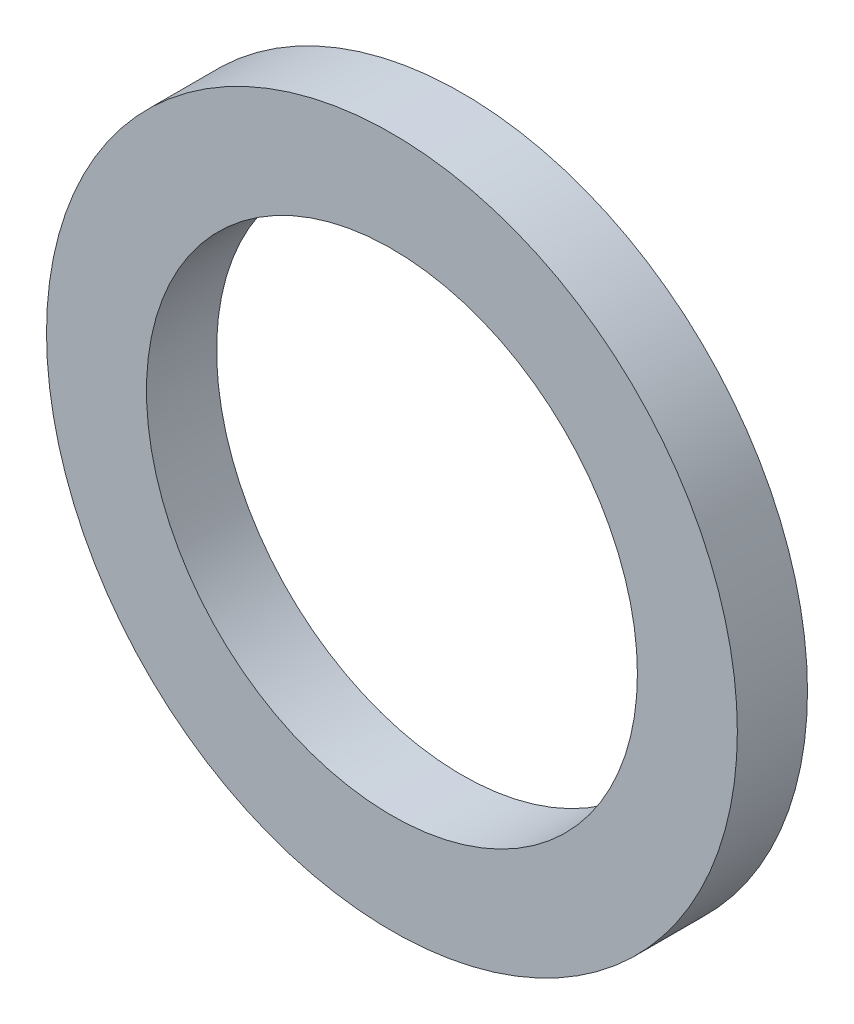
ISO-10303-21;
HEADER;
FILE_DESCRIPTION(('STEP AP214'),'2;1');
FILE_NAME('part.step','',(''),(''),'','','');
FILE_SCHEMA(('AUTOMOTIVE_DESIGN { 1 0 10303 214 1 1 1 1 }'));
ENDSEC;
DATA;
#1=APPLICATION_CONTEXT('core data for automotive mechanical design processes');
#2=APPLICATION_PROTOCOL_DEFINITION('international standard','automotive_design',2000,#1);
#3=PRODUCT_CONTEXT('',#1,'mechanical');
#4=PRODUCT('Part','Part','',(#3));
#5=PRODUCT_RELATED_PRODUCT_CATEGORY('part','',(#4));
#6=PRODUCT_DEFINITION_FORMATION('','',#4);
#7=PRODUCT_DEFINITION_CONTEXT('part definition',#1,'design');
#8=PRODUCT_DEFINITION('design','',#6,#7);
#9=PRODUCT_DEFINITION_SHAPE('','',#8);
#10=(LENGTH_UNIT() NAMED_UNIT(*) SI_UNIT(.MILLI.,.METRE.));
#11=(NAMED_UNIT(*) PLANE_ANGLE_UNIT() SI_UNIT($,.RADIAN.));
#12=(NAMED_UNIT(*) SI_UNIT($,.STERADIAN.) SOLID_ANGLE_UNIT());
#13=UNCERTAINTY_MEASURE_WITH_UNIT(LENGTH_MEASURE(1.E-05),#10,'distance_accuracy_value','');
#14=(GEOMETRIC_REPRESENTATION_CONTEXT(3) GLOBAL_UNCERTAINTY_ASSIGNED_CONTEXT((#13)) GLOBAL_UNIT_ASSIGNED_CONTEXT((#10,
#11,#12)) REPRESENTATION_CONTEXT('',''));
#15=CARTESIAN_POINT('',(0.,0.,0.));
#16=DIRECTION('',(0.,0.,1.));
#17=DIRECTION('',(1.,0.,0.));
#18=AXIS2_PLACEMENT_3D('',#15,#16,#17);
#19=CARTESIAN_POINT('',(0.,0.,1.));
#20=DIRECTION('',(0.,0.,1.));
#21=DIRECTION('',(1.,0.,0.));
#22=AXIS2_PLACEMENT_3D('',#19,#20,#21);
#23=PLANE('',#22);
#24=CARTESIAN_POINT('',(0.,0.,1.));
#25=DIRECTION('',(0.,0.,1.));
#26=DIRECTION('',(1.,0.,0.));
#27=AXIS2_PLACEMENT_3D('',#24,#25,#26);
#28=CIRCLE('',#27,4.925);
#29=CARTESIAN_POINT('',(4.925,0.,1.));
#30=VERTEX_POINT('',#29);
#31=EDGE_CURVE('E10',#30,#30,#28,.T.);
#32=ORIENTED_EDGE('',*,*,#31,.T.);
#33=EDGE_LOOP('',(#32));
#34=FACE_BOUND('',#33,.T.);
#35=CARTESIAN_POINT('',(0.,0.,1.));
#36=DIRECTION('',(0.,0.,1.));
#37=DIRECTION('',(1.,0.,0.));
#38=AXIS2_PLACEMENT_3D('',#35,#36,#37);
#39=CIRCLE('',#38,3.5);
#40=CARTESIAN_POINT('',(3.5,0.,1.));
#41=VERTEX_POINT('',#40);
#42=EDGE_CURVE('E42',#41,#41,#39,.T.);
#43=ORIENTED_EDGE('',*,*,#42,.F.);
#44=EDGE_LOOP('',(#43));
#45=FACE_BOUND('',#44,.T.);
#46=ADVANCED_FACE('F31',(#34,#45),#23,.T.);
#47=CARTESIAN_POINT('',(0.,0.,0.));
#48=DIRECTION('',(0.,0.,1.));
#49=DIRECTION('',(1.,0.,0.));
#50=AXIS2_PLACEMENT_3D('',#47,#48,#49);
#51=PLANE('',#50);
#52=CARTESIAN_POINT('',(0.,0.,0.));
#53=DIRECTION('',(0.,0.,1.));
#54=DIRECTION('',(1.,0.,0.));
#55=AXIS2_PLACEMENT_3D('',#52,#53,#54);
#56=CIRCLE('',#55,4.925);
#57=CARTESIAN_POINT('',(4.925,0.,0.));
#58=VERTEX_POINT('',#57);
#59=EDGE_CURVE('E35',#58,#58,#56,.T.);
#60=ORIENTED_EDGE('',*,*,#59,.F.);
#61=EDGE_LOOP('',(#60));
#62=FACE_BOUND('',#61,.T.);
#63=CARTESIAN_POINT('',(0.,0.,0.));
#64=DIRECTION('',(0.,0.,1.));
#65=DIRECTION('',(1.,0.,0.));
#66=AXIS2_PLACEMENT_3D('',#63,#64,#65);
#67=CIRCLE('',#66,3.5);
#68=CARTESIAN_POINT('',(3.5,0.,0.));
#69=VERTEX_POINT('',#68);
#70=EDGE_CURVE('E44',#69,#69,#67,.T.);
#71=ORIENTED_EDGE('',*,*,#70,.T.);
#72=EDGE_LOOP('',(#71));
#73=FACE_BOUND('',#72,.T.);
#74=ADVANCED_FACE('F54',(#62,#73),#51,.F.);
#75=CARTESIAN_POINT('',(0.,0.,1.));
#76=DIRECTION('',(0.,0.,-1.));
#77=DIRECTION('',(-1.,0.,0.));
#78=AXIS2_PLACEMENT_3D('',#75,#76,#77);
#79=CYLINDRICAL_SURFACE('',#78,4.925);
#80=ORIENTED_EDGE('',*,*,#31,.F.);
#81=EDGE_LOOP('',(#80));
#82=FACE_BOUND('',#81,.T.);
#83=ORIENTED_EDGE('',*,*,#59,.T.);
#84=EDGE_LOOP('',(#83));
#85=FACE_BOUND('',#84,.T.);
#86=ADVANCED_FACE('F33',(#82,#85),#79,.T.);
#87=CARTESIAN_POINT('',(0.,0.,1.));
#88=DIRECTION('',(0.,0.,-1.));
#89=DIRECTION('',(-1.,0.,0.));
#90=AXIS2_PLACEMENT_3D('',#87,#88,#89);
#91=CYLINDRICAL_SURFACE('',#90,3.5);
#92=ORIENTED_EDGE('',*,*,#42,.T.);
#93=EDGE_LOOP('',(#92));
#94=FACE_BOUND('',#93,.T.);
#95=ORIENTED_EDGE('',*,*,#70,.F.);
#96=EDGE_LOOP('',(#95));
#97=FACE_BOUND('',#96,.T.);
#98=ADVANCED_FACE('F50',(#94,#97),#91,.F.);
#99=CLOSED_SHELL('',(#46,#74,#86,#98));
#100=MANIFOLD_SOLID_BREP('B2',#99);
#101=ADVANCED_BREP_SHAPE_REPRESENTATION('',(#18,#100),#14);
#102=SHAPE_DEFINITION_REPRESENTATION(#9,#101);
ENDSEC;
END-ISO-10303-21;
